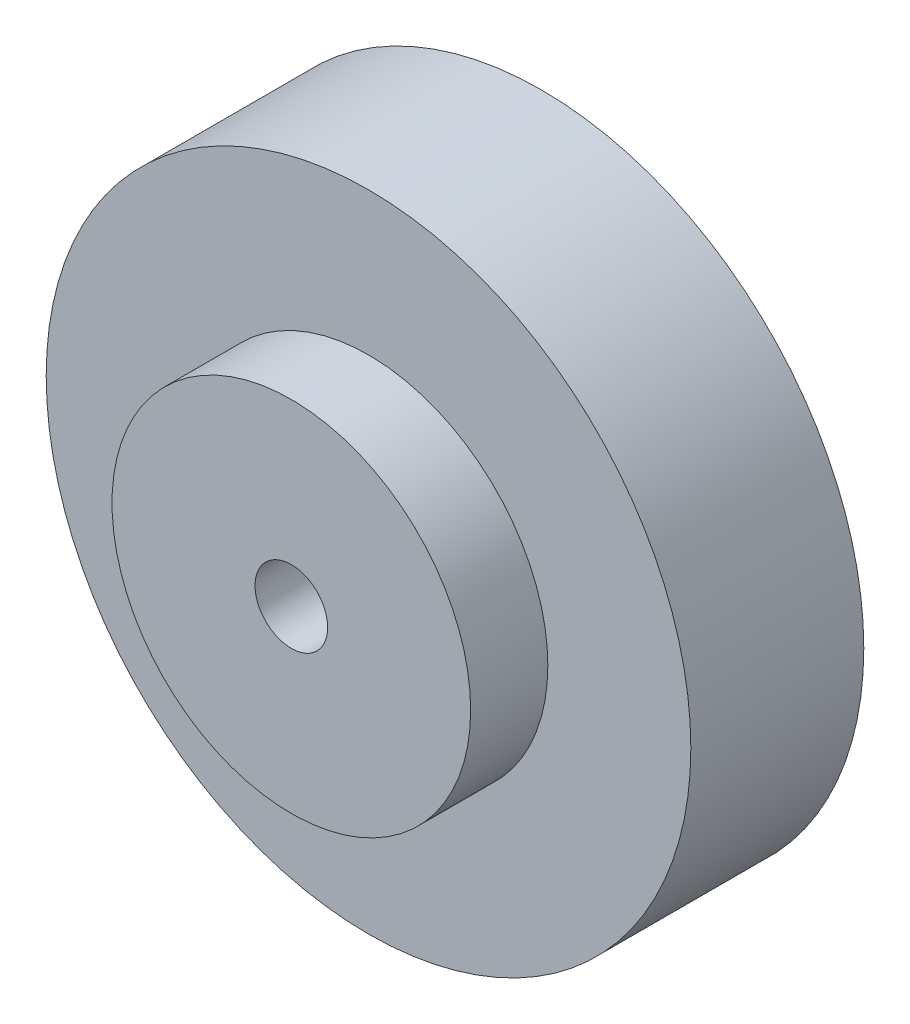
ISO-10303-21;
HEADER;
FILE_DESCRIPTION(('STEP AP214'),'2;1');
FILE_NAME('part.step','',(''),(''),'','','');
FILE_SCHEMA(('AUTOMOTIVE_DESIGN { 1 0 10303 214 1 1 1 1 }'));
ENDSEC;
DATA;
#1=APPLICATION_CONTEXT('core data for automotive mechanical design processes');
#2=APPLICATION_PROTOCOL_DEFINITION('international standard','automotive_design',2000,#1);
#3=PRODUCT_CONTEXT('',#1,'mechanical');
#4=PRODUCT('Part','Part','',(#3));
#5=PRODUCT_RELATED_PRODUCT_CATEGORY('part','',(#4));
#6=PRODUCT_DEFINITION_FORMATION('','',#4);
#7=PRODUCT_DEFINITION_CONTEXT('part definition',#1,'design');
#8=PRODUCT_DEFINITION('design','',#6,#7);
#9=PRODUCT_DEFINITION_SHAPE('','',#8);
#10=(LENGTH_UNIT() NAMED_UNIT(*) SI_UNIT(.MILLI.,.METRE.));
#11=(NAMED_UNIT(*) PLANE_ANGLE_UNIT() SI_UNIT($,.RADIAN.));
#12=(NAMED_UNIT(*) SI_UNIT($,.STERADIAN.) SOLID_ANGLE_UNIT());
#13=UNCERTAINTY_MEASURE_WITH_UNIT(LENGTH_MEASURE(1.E-05),#10,'distance_accuracy_value','');
#14=(GEOMETRIC_REPRESENTATION_CONTEXT(3) GLOBAL_UNCERTAINTY_ASSIGNED_CONTEXT((#13)) GLOBAL_UNIT_ASSIGNED_CONTEXT((#10,
#11,#12)) REPRESENTATION_CONTEXT('',''));
#15=CARTESIAN_POINT('',(0.,0.,0.));
#16=DIRECTION('',(0.,0.,1.));
#17=DIRECTION('',(1.,0.,0.));
#18=AXIS2_PLACEMENT_3D('',#15,#16,#17);
#19=CARTESIAN_POINT('',(0.,0.,7.62));
#20=DIRECTION('',(0.,0.,-1.));
#21=DIRECTION('',(-1.,0.,0.));
#22=AXIS2_PLACEMENT_3D('',#19,#20,#21);
#23=CYLINDRICAL_SURFACE('',#22,14.2);
#24=CARTESIAN_POINT('',(0.,0.,7.62));
#25=DIRECTION('',(0.,0.,1.));
#26=DIRECTION('',(1.,0.,0.));
#27=AXIS2_PLACEMENT_3D('',#24,#25,#26);
#28=CIRCLE('',#27,14.2);
#29=CARTESIAN_POINT('',(14.2,0.,7.62));
#30=VERTEX_POINT('',#29);
#31=EDGE_CURVE('E38',#30,#30,#28,.T.);
#32=ORIENTED_EDGE('',*,*,#31,.F.);
#33=EDGE_LOOP('',(#32));
#34=FACE_BOUND('',#33,.T.);
#35=CARTESIAN_POINT('',(0.,0.,0.));
#36=DIRECTION('',(0.,0.,1.));
#37=DIRECTION('',(1.,0.,0.));
#38=AXIS2_PLACEMENT_3D('',#35,#36,#37);
#39=CIRCLE('',#38,14.2);
#40=CARTESIAN_POINT('',(14.2,0.,0.));
#41=VERTEX_POINT('',#40);
#42=EDGE_CURVE('E34',#41,#41,#39,.T.);
#43=ORIENTED_EDGE('',*,*,#42,.T.);
#44=EDGE_LOOP('',(#43));
#45=FACE_BOUND('',#44,.T.);
#46=ADVANCED_FACE('F31',(#34,#45),#23,.T.);
#47=CARTESIAN_POINT('',(0.,0.,7.62));
#48=DIRECTION('',(0.,0.,1.));
#49=DIRECTION('',(1.,0.,0.));
#50=AXIS2_PLACEMENT_3D('',#47,#48,#49);
#51=PLANE('',#50);
#52=CARTESIAN_POINT('',(0.,0.,7.62));
#53=DIRECTION('',(0.,0.,1.));
#54=DIRECTION('',(1.,0.,0.));
#55=AXIS2_PLACEMENT_3D('',#52,#53,#54);
#56=CIRCLE('',#55,7.9);
#57=CARTESIAN_POINT('',(7.9,0.,7.62));
#58=VERTEX_POINT('',#57);
#59=EDGE_CURVE('E10',#58,#58,#56,.T.);
#60=ORIENTED_EDGE('',*,*,#59,.F.);
#61=EDGE_LOOP('',(#60));
#62=FACE_BOUND('',#61,.T.);
#63=ORIENTED_EDGE('',*,*,#31,.T.);
#64=EDGE_LOOP('',(#63));
#65=FACE_BOUND('',#64,.T.);
#66=ADVANCED_FACE('F67',(#62,#65),#51,.T.);
#67=CARTESIAN_POINT('',(0.,0.,0.));
#68=DIRECTION('',(0.,0.,1.));
#69=DIRECTION('',(1.,0.,0.));
#70=AXIS2_PLACEMENT_3D('',#67,#68,#69);
#71=PLANE('',#70);
#72=CARTESIAN_POINT('',(0.,0.,0.));
#73=DIRECTION('',(0.,0.,-1.));
#74=DIRECTION('',(-1.,0.,0.));
#75=AXIS2_PLACEMENT_3D('',#72,#73,#74);
#76=CIRCLE('',#75,1.6);
#77=CARTESIAN_POINT('',(-1.6,0.,0.));
#78=VERTEX_POINT('',#77);
#79=EDGE_CURVE('E48',#78,#78,#76,.T.);
#80=ORIENTED_EDGE('',*,*,#79,.F.);
#81=EDGE_LOOP('',(#80));
#82=FACE_BOUND('',#81,.T.);
#83=ORIENTED_EDGE('',*,*,#42,.F.);
#84=EDGE_LOOP('',(#83));
#85=FACE_BOUND('',#84,.T.);
#86=ADVANCED_FACE('F63',(#82,#85),#71,.F.);
#87=CARTESIAN_POINT('',(0.,0.,11.02));
#88=DIRECTION('',(0.,0.,-1.));
#89=DIRECTION('',(-1.,0.,0.));
#90=AXIS2_PLACEMENT_3D('',#87,#88,#89);
#91=CYLINDRICAL_SURFACE('',#90,7.9);
#92=CARTESIAN_POINT('',(0.,0.,11.02));
#93=DIRECTION('',(0.,0.,1.));
#94=DIRECTION('',(1.,0.,0.));
#95=AXIS2_PLACEMENT_3D('',#92,#93,#94);
#96=CIRCLE('',#95,7.9);
#97=CARTESIAN_POINT('',(7.9,0.,11.02));
#98=VERTEX_POINT('',#97);
#99=EDGE_CURVE('E44',#98,#98,#96,.T.);
#100=ORIENTED_EDGE('',*,*,#99,.F.);
#101=EDGE_LOOP('',(#100));
#102=FACE_BOUND('',#101,.T.);
#103=ORIENTED_EDGE('',*,*,#59,.T.);
#104=EDGE_LOOP('',(#103));
#105=FACE_BOUND('',#104,.T.);
#106=ADVANCED_FACE('F66',(#102,#105),#91,.T.);
#107=CARTESIAN_POINT('',(0.,0.,11.02));
#108=DIRECTION('',(0.,0.,1.));
#109=DIRECTION('',(1.,0.,0.));
#110=AXIS2_PLACEMENT_3D('',#107,#108,#109);
#111=PLANE('',#110);
#112=CARTESIAN_POINT('',(0.,0.,11.02));
#113=DIRECTION('',(0.,0.,-1.));
#114=DIRECTION('',(-1.,0.,0.));
#115=AXIS2_PLACEMENT_3D('',#112,#113,#114);
#116=CIRCLE('',#115,1.6);
#117=CARTESIAN_POINT('',(-1.6,0.,11.02));
#118=VERTEX_POINT('',#117);
#119=EDGE_CURVE('E47',#118,#118,#116,.T.);
#120=ORIENTED_EDGE('',*,*,#119,.T.);
#121=EDGE_LOOP('',(#120));
#122=FACE_BOUND('',#121,.T.);
#123=ORIENTED_EDGE('',*,*,#99,.T.);
#124=EDGE_LOOP('',(#123));
#125=FACE_BOUND('',#124,.T.);
#126=ADVANCED_FACE('F54',(#122,#125),#111,.T.);
#127=CARTESIAN_POINT('',(0.,0.,11.02));
#128=DIRECTION('',(0.,0.,-1.));
#129=DIRECTION('',(-1.,0.,0.));
#130=AXIS2_PLACEMENT_3D('',#127,#128,#129);
#131=CYLINDRICAL_SURFACE('',#130,1.6);
#132=ORIENTED_EDGE('',*,*,#119,.F.);
#133=EDGE_LOOP('',(#132));
#134=FACE_BOUND('',#133,.T.);
#135=ORIENTED_EDGE('',*,*,#79,.T.);
#136=EDGE_LOOP('',(#135));
#137=FACE_BOUND('',#136,.T.);
#138=ADVANCED_FACE('F57',(#134,#137),#131,.F.);
#139=CLOSED_SHELL('',(#46,#66,#86,#106,#126,#138));
#140=MANIFOLD_SOLID_BREP('B2',#139);
#141=ADVANCED_BREP_SHAPE_REPRESENTATION('',(#18,#140),#14);
#142=SHAPE_DEFINITION_REPRESENTATION(#9,#141);
ENDSEC;
END-ISO-10303-21;
